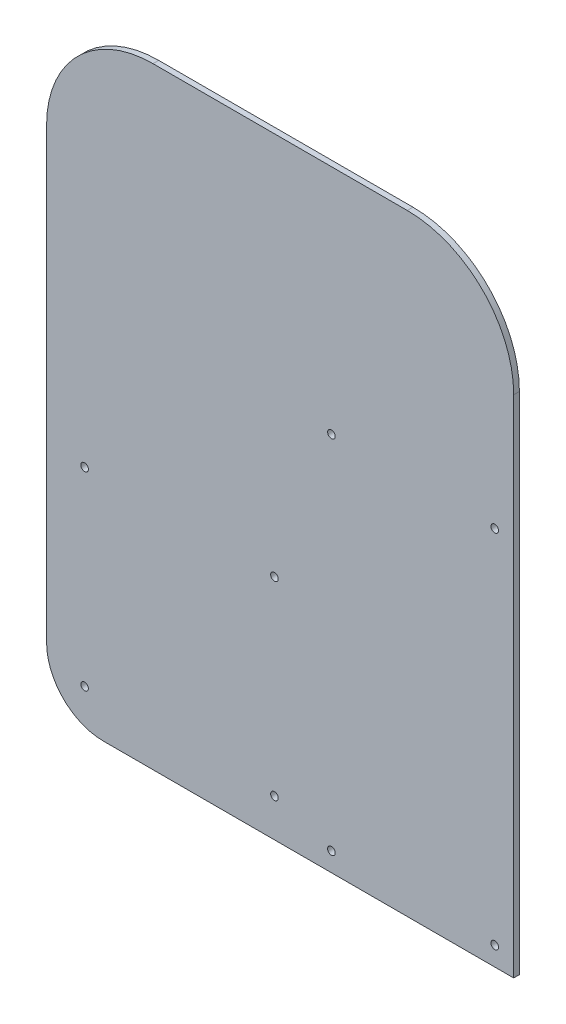
ISO-10303-21;
HEADER;
FILE_DESCRIPTION(('STEP AP214'),'2;1');
FILE_NAME('part.step','',(''),(''),'','','');
FILE_SCHEMA(('AUTOMOTIVE_DESIGN { 1 0 10303 214 1 1 1 1 }'));
ENDSEC;
DATA;
#1=APPLICATION_CONTEXT('core data for automotive mechanical design processes');
#2=APPLICATION_PROTOCOL_DEFINITION('international standard','automotive_design',2000,#1);
#3=PRODUCT_CONTEXT('',#1,'mechanical');
#4=PRODUCT('Part','Part','',(#3));
#5=PRODUCT_RELATED_PRODUCT_CATEGORY('part','',(#4));
#6=PRODUCT_DEFINITION_FORMATION('','',#4);
#7=PRODUCT_DEFINITION_CONTEXT('part definition',#1,'design');
#8=PRODUCT_DEFINITION('design','',#6,#7);
#9=PRODUCT_DEFINITION_SHAPE('','',#8);
#10=(LENGTH_UNIT() NAMED_UNIT(*) SI_UNIT(.MILLI.,.METRE.));
#11=(NAMED_UNIT(*) PLANE_ANGLE_UNIT() SI_UNIT($,.RADIAN.));
#12=(NAMED_UNIT(*) SI_UNIT($,.STERADIAN.) SOLID_ANGLE_UNIT());
#13=UNCERTAINTY_MEASURE_WITH_UNIT(LENGTH_MEASURE(1.E-05),#10,'distance_accuracy_value','');
#14=(GEOMETRIC_REPRESENTATION_CONTEXT(3) GLOBAL_UNCERTAINTY_ASSIGNED_CONTEXT((#13)) GLOBAL_UNIT_ASSIGNED_CONTEXT((#10,
#11,#12)) REPRESENTATION_CONTEXT('',''));
#15=CARTESIAN_POINT('',(0.,0.,0.));
#16=DIRECTION('',(0.,0.,1.));
#17=DIRECTION('',(1.,0.,0.));
#18=AXIS2_PLACEMENT_3D('',#15,#16,#17);
#19=CARTESIAN_POINT('',(30.,0.,3.));
#20=DIRECTION('',(0.,0.,1.));
#21=DIRECTION('',(1.,0.,0.));
#22=AXIS2_PLACEMENT_3D('',#19,#20,#21);
#23=PLANE('',#22);
#24=CARTESIAN_POINT('',(236.,-20.,3.));
#25=DIRECTION('',(0.,0.,1.));
#26=DIRECTION('',(1.,0.,0.));
#27=AXIS2_PLACEMENT_3D('',#24,#25,#26);
#28=CIRCLE('',#27,2.);
#29=CARTESIAN_POINT('',(238.,-20.,3.));
#30=VERTEX_POINT('',#29);
#31=EDGE_CURVE('E238',#30,#30,#28,.T.);
#32=ORIENTED_EDGE('',*,*,#31,.F.);
#33=EDGE_LOOP('',(#32));
#34=FACE_BOUND('',#33,.T.);
#35=CARTESIAN_POINT('',(150.,170.,3.));
#36=DIRECTION('',(0.,0.,1.));
#37=DIRECTION('',(1.,0.,0.));
#38=AXIS2_PLACEMENT_3D('',#35,#36,#37);
#39=CIRCLE('',#38,2.);
#40=CARTESIAN_POINT('',(152.,170.,3.));
#41=VERTEX_POINT('',#40);
#42=EDGE_CURVE('E222',#41,#41,#39,.T.);
#43=ORIENTED_EDGE('',*,*,#42,.F.);
#44=EDGE_LOOP('',(#43));
#45=FACE_BOUND('',#44,.T.);
#46=CARTESIAN_POINT('',(120.,90.,3.));
#47=DIRECTION('',(0.,0.,1.));
#48=DIRECTION('',(1.,0.,0.));
#49=AXIS2_PLACEMENT_3D('',#46,#47,#48);
#50=CIRCLE('',#49,2.);
#51=CARTESIAN_POINT('',(122.,90.,3.));
#52=VERTEX_POINT('',#51);
#53=EDGE_CURVE('E206',#52,#52,#50,.T.);
#54=ORIENTED_EDGE('',*,*,#53,.F.);
#55=EDGE_LOOP('',(#54));
#56=FACE_BOUND('',#55,.T.);
#57=CARTESIAN_POINT('',(20.,-9.99999999999999,3.));
#58=DIRECTION('',(0.,0.,1.));
#59=DIRECTION('',(1.,0.,0.));
#60=AXIS2_PLACEMENT_3D('',#57,#58,#59);
#61=CIRCLE('',#60,2.);
#62=CARTESIAN_POINT('',(22.,-9.99999999999999,3.));
#63=VERTEX_POINT('',#62);
#64=EDGE_CURVE('E145',#63,#63,#61,.T.);
#65=ORIENTED_EDGE('',*,*,#64,.F.);
#66=EDGE_LOOP('',(#65));
#67=FACE_BOUND('',#66,.T.);
#68=CARTESIAN_POINT('',(30.,0.,3.));
#69=DIRECTION('',(0.,0.,1.));
#70=DIRECTION('',(1.,0.,0.));
#71=AXIS2_PLACEMENT_3D('',#68,#69,#70);
#72=CIRCLE('',#71,30.);
#73=CARTESIAN_POINT('',(0.,0.,3.));
#74=VERTEX_POINT('',#73);
#75=CARTESIAN_POINT('',(30.,-30.,3.));
#76=VERTEX_POINT('',#75);
#77=EDGE_CURVE('E162',#74,#76,#72,.T.);
#78=ORIENTED_EDGE('',*,*,#77,.T.);
#79=DIRECTION('',(1.,0.,0.));
#80=VECTOR('',#79,1.);
#81=CARTESIAN_POINT('',(30.,-30.,3.));
#82=LINE('',#81,#80);
#83=CARTESIAN_POINT('',(246.,-30.,3.));
#84=VERTEX_POINT('',#83);
#85=EDGE_CURVE('E99',#76,#84,#82,.T.);
#86=ORIENTED_EDGE('',*,*,#85,.T.);
#87=DIRECTION('',(0.,1.,0.));
#88=VECTOR('',#87,1.);
#89=CARTESIAN_POINT('',(246.,180.,3.));
#90=LINE('',#89,#88);
#91=CARTESIAN_POINT('',(246.,235.988905846354,3.));
#92=VERTEX_POINT('',#91);
#93=EDGE_CURVE('E178',#84,#92,#90,.T.);
#94=ORIENTED_EDGE('',*,*,#93,.T.);
#95=CARTESIAN_POINT('',(189.951998033855,235.988905846354,3.));
#96=DIRECTION('',(0.,0.,1.));
#97=DIRECTION('',(1.,0.,0.));
#98=AXIS2_PLACEMENT_3D('',#95,#96,#97);
#99=CIRCLE('',#98,56.0480019661446);
#100=CARTESIAN_POINT('',(189.951998033855,292.036907812499,3.));
#101=VERTEX_POINT('',#100);
#102=EDGE_CURVE('E116',#92,#101,#99,.T.);
#103=ORIENTED_EDGE('',*,*,#102,.T.);
#104=DIRECTION('',(-1.,0.,0.));
#105=VECTOR('',#104,1.);
#106=CARTESIAN_POINT('',(56.0480019661446,292.036907812499,3.));
#107=LINE('',#106,#105);
#108=CARTESIAN_POINT('',(56.0480019661446,292.036907812499,3.));
#109=VERTEX_POINT('',#108);
#110=EDGE_CURVE('E109',#101,#109,#107,.T.);
#111=ORIENTED_EDGE('',*,*,#110,.T.);
#112=CARTESIAN_POINT('',(56.0480019661446,235.988905846354,3.));
#113=DIRECTION('',(0.,0.,1.));
#114=DIRECTION('',(-1.,0.,0.));
#115=AXIS2_PLACEMENT_3D('',#112,#113,#114);
#116=CIRCLE('',#115,56.0480019661446);
#117=CARTESIAN_POINT('',(0.,235.988905846354,3.));
#118=VERTEX_POINT('',#117);
#119=EDGE_CURVE('E113',#109,#118,#116,.T.);
#120=ORIENTED_EDGE('',*,*,#119,.T.);
#121=DIRECTION('',(0.,-1.,0.));
#122=VECTOR('',#121,1.);
#123=CARTESIAN_POINT('',(0.,80.,3.));
#124=LINE('',#123,#122);
#125=EDGE_CURVE('E61',#118,#74,#124,.T.);
#126=ORIENTED_EDGE('',*,*,#125,.T.);
#127=EDGE_LOOP('',(#78,#86,#94,#103,#111,#120,#126));
#128=FACE_BOUND('',#127,.T.);
#129=CARTESIAN_POINT('',(120.,-9.99999999999999,3.));
#130=DIRECTION('',(0.,0.,1.));
#131=DIRECTION('',(-1.,0.,0.));
#132=AXIS2_PLACEMENT_3D('',#129,#130,#131);
#133=CIRCLE('',#132,2.);
#134=CARTESIAN_POINT('',(118.,-9.99999999999999,3.));
#135=VERTEX_POINT('',#134);
#136=EDGE_CURVE('E198',#135,#135,#133,.T.);
#137=ORIENTED_EDGE('',*,*,#136,.F.);
#138=EDGE_LOOP('',(#137));
#139=FACE_BOUND('',#138,.T.);
#140=CARTESIAN_POINT('',(20.,90.,3.));
#141=DIRECTION('',(0.,0.,1.));
#142=DIRECTION('',(-1.,0.,0.));
#143=AXIS2_PLACEMENT_3D('',#140,#141,#142);
#144=CIRCLE('',#143,2.);
#145=CARTESIAN_POINT('',(18.,90.,3.));
#146=VERTEX_POINT('',#145);
#147=EDGE_CURVE('E214',#146,#146,#144,.T.);
#148=ORIENTED_EDGE('',*,*,#147,.F.);
#149=EDGE_LOOP('',(#148));
#150=FACE_BOUND('',#149,.T.);
#151=CARTESIAN_POINT('',(236.,170.,3.));
#152=DIRECTION('',(0.,0.,1.));
#153=DIRECTION('',(-1.,0.,0.));
#154=AXIS2_PLACEMENT_3D('',#151,#152,#153);
#155=CIRCLE('',#154,2.);
#156=CARTESIAN_POINT('',(234.,170.,3.));
#157=VERTEX_POINT('',#156);
#158=EDGE_CURVE('E230',#157,#157,#155,.T.);
#159=ORIENTED_EDGE('',*,*,#158,.F.);
#160=EDGE_LOOP('',(#159));
#161=FACE_BOUND('',#160,.T.);
#162=CARTESIAN_POINT('',(150.,-20.,3.));
#163=DIRECTION('',(0.,0.,1.));
#164=DIRECTION('',(-1.,0.,0.));
#165=AXIS2_PLACEMENT_3D('',#162,#163,#164);
#166=CIRCLE('',#165,2.);
#167=CARTESIAN_POINT('',(148.,-20.,3.));
#168=VERTEX_POINT('',#167);
#169=EDGE_CURVE('E246',#168,#168,#166,.T.);
#170=ORIENTED_EDGE('',*,*,#169,.F.);
#171=EDGE_LOOP('',(#170));
#172=FACE_BOUND('',#171,.T.);
#173=ADVANCED_FACE('F43',(#34,#45,#56,#67,#128,#139,#150,#161,#172),#23,.T.);
#174=CARTESIAN_POINT('',(30.,0.,0.));
#175=DIRECTION('',(0.,0.,1.));
#176=DIRECTION('',(1.,0.,0.));
#177=AXIS2_PLACEMENT_3D('',#174,#175,#176);
#178=PLANE('',#177);
#179=CARTESIAN_POINT('',(30.,0.,0.));
#180=DIRECTION('',(0.,0.,1.));
#181=DIRECTION('',(1.,0.,0.));
#182=AXIS2_PLACEMENT_3D('',#179,#180,#181);
#183=CIRCLE('',#182,30.);
#184=CARTESIAN_POINT('',(0.,0.,0.));
#185=VERTEX_POINT('',#184);
#186=CARTESIAN_POINT('',(30.,-30.,0.));
#187=VERTEX_POINT('',#186);
#188=EDGE_CURVE('E140',#185,#187,#183,.T.);
#189=ORIENTED_EDGE('',*,*,#188,.F.);
#190=DIRECTION('',(0.,-1.,0.));
#191=VECTOR('',#190,1.);
#192=CARTESIAN_POINT('',(0.,0.,0.));
#193=LINE('',#192,#191);
#194=CARTESIAN_POINT('',(0.,235.988905846354,0.));
#195=VERTEX_POINT('',#194);
#196=EDGE_CURVE('E87',#195,#185,#193,.T.);
#197=ORIENTED_EDGE('',*,*,#196,.F.);
#198=CARTESIAN_POINT('',(56.0480019661446,235.988905846354,0.));
#199=DIRECTION('',(0.,0.,1.));
#200=DIRECTION('',(-1.,0.,0.));
#201=AXIS2_PLACEMENT_3D('',#198,#199,#200);
#202=CIRCLE('',#201,56.0480019661446);
#203=CARTESIAN_POINT('',(56.0480019661446,292.036907812499,0.));
#204=VERTEX_POINT('',#203);
#205=EDGE_CURVE('E157',#204,#195,#202,.T.);
#206=ORIENTED_EDGE('',*,*,#205,.F.);
#207=DIRECTION('',(-1.,0.,0.));
#208=VECTOR('',#207,1.);
#209=CARTESIAN_POINT('',(56.0480019661446,292.036907812499,0.));
#210=LINE('',#209,#208);
#211=CARTESIAN_POINT('',(189.951998033855,292.036907812499,0.));
#212=VERTEX_POINT('',#211);
#213=EDGE_CURVE('E126',#212,#204,#210,.T.);
#214=ORIENTED_EDGE('',*,*,#213,.F.);
#215=CARTESIAN_POINT('',(189.951998033855,235.988905846354,0.));
#216=DIRECTION('',(0.,0.,1.));
#217=DIRECTION('',(1.,0.,0.));
#218=AXIS2_PLACEMENT_3D('',#215,#216,#217);
#219=CIRCLE('',#218,56.0480019661446);
#220=CARTESIAN_POINT('',(246.,235.988905846354,0.));
#221=VERTEX_POINT('',#220);
#222=EDGE_CURVE('E152',#221,#212,#219,.T.);
#223=ORIENTED_EDGE('',*,*,#222,.F.);
#224=DIRECTION('',(0.,1.,0.));
#225=VECTOR('',#224,1.);
#226=CARTESIAN_POINT('',(246.,180.,0.));
#227=LINE('',#226,#225);
#228=CARTESIAN_POINT('',(246.,-30.,0.));
#229=VERTEX_POINT('',#228);
#230=EDGE_CURVE('E149',#229,#221,#227,.T.);
#231=ORIENTED_EDGE('',*,*,#230,.F.);
#232=DIRECTION('',(1.,0.,0.));
#233=VECTOR('',#232,1.);
#234=CARTESIAN_POINT('',(246.,-30.,0.));
#235=LINE('',#234,#233);
#236=EDGE_CURVE('E144',#187,#229,#235,.T.);
#237=ORIENTED_EDGE('',*,*,#236,.F.);
#238=EDGE_LOOP('',(#189,#197,#206,#214,#223,#231,#237));
#239=FACE_BOUND('',#238,.T.);
#240=CARTESIAN_POINT('',(20.,-9.99999999999999,0.));
#241=DIRECTION('',(0.,0.,1.));
#242=DIRECTION('',(1.,0.,0.));
#243=AXIS2_PLACEMENT_3D('',#240,#241,#242);
#244=CIRCLE('',#243,2.);
#245=CARTESIAN_POINT('',(22.,-9.99999999999999,0.));
#246=VERTEX_POINT('',#245);
#247=EDGE_CURVE('E194',#246,#246,#244,.T.);
#248=ORIENTED_EDGE('',*,*,#247,.T.);
#249=EDGE_LOOP('',(#248));
#250=FACE_BOUND('',#249,.T.);
#251=CARTESIAN_POINT('',(120.,-9.99999999999999,0.));
#252=DIRECTION('',(0.,0.,1.));
#253=DIRECTION('',(-1.,0.,0.));
#254=AXIS2_PLACEMENT_3D('',#251,#252,#253);
#255=CIRCLE('',#254,2.);
#256=CARTESIAN_POINT('',(118.,-9.99999999999999,0.));
#257=VERTEX_POINT('',#256);
#258=EDGE_CURVE('E202',#257,#257,#255,.T.);
#259=ORIENTED_EDGE('',*,*,#258,.T.);
#260=EDGE_LOOP('',(#259));
#261=FACE_BOUND('',#260,.T.);
#262=CARTESIAN_POINT('',(120.,90.,0.));
#263=DIRECTION('',(0.,0.,1.));
#264=DIRECTION('',(1.,0.,0.));
#265=AXIS2_PLACEMENT_3D('',#262,#263,#264);
#266=CIRCLE('',#265,2.);
#267=CARTESIAN_POINT('',(122.,90.,0.));
#268=VERTEX_POINT('',#267);
#269=EDGE_CURVE('E210',#268,#268,#266,.T.);
#270=ORIENTED_EDGE('',*,*,#269,.T.);
#271=EDGE_LOOP('',(#270));
#272=FACE_BOUND('',#271,.T.);
#273=CARTESIAN_POINT('',(20.,90.,0.));
#274=DIRECTION('',(0.,0.,1.));
#275=DIRECTION('',(-1.,0.,0.));
#276=AXIS2_PLACEMENT_3D('',#273,#274,#275);
#277=CIRCLE('',#276,2.);
#278=CARTESIAN_POINT('',(18.,90.,0.));
#279=VERTEX_POINT('',#278);
#280=EDGE_CURVE('E218',#279,#279,#277,.T.);
#281=ORIENTED_EDGE('',*,*,#280,.T.);
#282=EDGE_LOOP('',(#281));
#283=FACE_BOUND('',#282,.T.);
#284=CARTESIAN_POINT('',(150.,170.,0.));
#285=DIRECTION('',(0.,0.,1.));
#286=DIRECTION('',(1.,0.,0.));
#287=AXIS2_PLACEMENT_3D('',#284,#285,#286);
#288=CIRCLE('',#287,2.);
#289=CARTESIAN_POINT('',(152.,170.,0.));
#290=VERTEX_POINT('',#289);
#291=EDGE_CURVE('E226',#290,#290,#288,.T.);
#292=ORIENTED_EDGE('',*,*,#291,.T.);
#293=EDGE_LOOP('',(#292));
#294=FACE_BOUND('',#293,.T.);
#295=CARTESIAN_POINT('',(236.,170.,0.));
#296=DIRECTION('',(0.,0.,1.));
#297=DIRECTION('',(-1.,0.,0.));
#298=AXIS2_PLACEMENT_3D('',#295,#296,#297);
#299=CIRCLE('',#298,2.);
#300=CARTESIAN_POINT('',(234.,170.,0.));
#301=VERTEX_POINT('',#300);
#302=EDGE_CURVE('E234',#301,#301,#299,.T.);
#303=ORIENTED_EDGE('',*,*,#302,.T.);
#304=EDGE_LOOP('',(#303));
#305=FACE_BOUND('',#304,.T.);
#306=CARTESIAN_POINT('',(236.,-20.,0.));
#307=DIRECTION('',(0.,0.,1.));
#308=DIRECTION('',(1.,0.,0.));
#309=AXIS2_PLACEMENT_3D('',#306,#307,#308);
#310=CIRCLE('',#309,2.);
#311=CARTESIAN_POINT('',(238.,-20.,0.));
#312=VERTEX_POINT('',#311);
#313=EDGE_CURVE('E242',#312,#312,#310,.T.);
#314=ORIENTED_EDGE('',*,*,#313,.T.);
#315=EDGE_LOOP('',(#314));
#316=FACE_BOUND('',#315,.T.);
#317=CARTESIAN_POINT('',(150.,-20.,0.));
#318=DIRECTION('',(0.,0.,1.));
#319=DIRECTION('',(-1.,0.,0.));
#320=AXIS2_PLACEMENT_3D('',#317,#318,#319);
#321=CIRCLE('',#320,2.);
#322=CARTESIAN_POINT('',(148.,-20.,0.));
#323=VERTEX_POINT('',#322);
#324=EDGE_CURVE('E250',#323,#323,#321,.T.);
#325=ORIENTED_EDGE('',*,*,#324,.T.);
#326=EDGE_LOOP('',(#325));
#327=FACE_BOUND('',#326,.T.);
#328=ADVANCED_FACE('F181',(#239,#250,#261,#272,#283,#294,#305,#316,#327),#178,.F.);
#329=CARTESIAN_POINT('',(30.,0.,3.));
#330=DIRECTION('',(0.,0.,-1.));
#331=DIRECTION('',(-1.,0.,0.));
#332=AXIS2_PLACEMENT_3D('',#329,#330,#331);
#333=CYLINDRICAL_SURFACE('',#332,30.);
#334=ORIENTED_EDGE('',*,*,#188,.T.);
#335=DIRECTION('',(0.,0.,-1.));
#336=VECTOR('',#335,1.);
#337=CARTESIAN_POINT('',(30.,-30.,3.));
#338=LINE('',#337,#336);
#339=EDGE_CURVE('E11',#76,#187,#338,.T.);
#340=ORIENTED_EDGE('',*,*,#339,.F.);
#341=ORIENTED_EDGE('',*,*,#77,.F.);
#342=DIRECTION('',(0.,0.,-1.));
#343=VECTOR('',#342,1.);
#344=CARTESIAN_POINT('',(0.,0.,3.));
#345=LINE('',#344,#343);
#346=EDGE_CURVE('E136',#74,#185,#345,.T.);
#347=ORIENTED_EDGE('',*,*,#346,.T.);
#348=EDGE_LOOP('',(#334,#340,#341,#347));
#349=FACE_BOUND('',#348,.T.);
#350=ADVANCED_FACE('F45',(#349),#333,.T.);
#351=CARTESIAN_POINT('',(246.,-30.,3.));
#352=DIRECTION('',(0.,1.,0.));
#353=DIRECTION('',(-1.,0.,0.));
#354=AXIS2_PLACEMENT_3D('',#351,#352,#353);
#355=PLANE('',#354);
#356=ORIENTED_EDGE('',*,*,#236,.T.);
#357=DIRECTION('',(0.,0.,-1.));
#358=VECTOR('',#357,1.);
#359=CARTESIAN_POINT('',(246.,-30.,3.));
#360=LINE('',#359,#358);
#361=EDGE_CURVE('E53',#84,#229,#360,.T.);
#362=ORIENTED_EDGE('',*,*,#361,.F.);
#363=ORIENTED_EDGE('',*,*,#85,.F.);
#364=ORIENTED_EDGE('',*,*,#339,.T.);
#365=EDGE_LOOP('',(#356,#362,#363,#364));
#366=FACE_BOUND('',#365,.T.);
#367=ADVANCED_FACE('F179',(#366),#355,.F.);
#368=CARTESIAN_POINT('',(246.,180.,3.));
#369=DIRECTION('',(-1.,0.,0.));
#370=DIRECTION('',(0.,-1.,0.));
#371=AXIS2_PLACEMENT_3D('',#368,#369,#370);
#372=PLANE('',#371);
#373=ORIENTED_EDGE('',*,*,#230,.T.);
#374=DIRECTION('',(0.,0.,-1.));
#375=VECTOR('',#374,1.);
#376=CARTESIAN_POINT('',(246.,235.988905846354,3.));
#377=LINE('',#376,#375);
#378=EDGE_CURVE('E169',#92,#221,#377,.T.);
#379=ORIENTED_EDGE('',*,*,#378,.F.);
#380=ORIENTED_EDGE('',*,*,#93,.F.);
#381=ORIENTED_EDGE('',*,*,#361,.T.);
#382=EDGE_LOOP('',(#373,#379,#380,#381));
#383=FACE_BOUND('',#382,.T.);
#384=ADVANCED_FACE('F176',(#383),#372,.F.);
#385=CARTESIAN_POINT('',(189.951998033855,235.988905846354,3.));
#386=DIRECTION('',(0.,0.,-1.));
#387=DIRECTION('',(-1.,0.,0.));
#388=AXIS2_PLACEMENT_3D('',#385,#386,#387);
#389=CYLINDRICAL_SURFACE('',#388,56.0480019661446);
#390=ORIENTED_EDGE('',*,*,#222,.T.);
#391=DIRECTION('',(0.,0.,-1.));
#392=VECTOR('',#391,1.);
#393=CARTESIAN_POINT('',(189.951998033855,292.036907812499,3.));
#394=LINE('',#393,#392);
#395=EDGE_CURVE('E129',#101,#212,#394,.T.);
#396=ORIENTED_EDGE('',*,*,#395,.F.);
#397=ORIENTED_EDGE('',*,*,#102,.F.);
#398=ORIENTED_EDGE('',*,*,#378,.T.);
#399=EDGE_LOOP('',(#390,#396,#397,#398));
#400=FACE_BOUND('',#399,.T.);
#401=ADVANCED_FACE('F185',(#400),#389,.T.);
#402=CARTESIAN_POINT('',(56.0480019661446,292.036907812499,3.));
#403=DIRECTION('',(0.,-1.,0.));
#404=DIRECTION('',(1.,0.,0.));
#405=AXIS2_PLACEMENT_3D('',#402,#403,#404);
#406=PLANE('',#405);
#407=ORIENTED_EDGE('',*,*,#213,.T.);
#408=DIRECTION('',(0.,0.,-1.));
#409=VECTOR('',#408,1.);
#410=CARTESIAN_POINT('',(56.0480019661446,292.036907812499,3.));
#411=LINE('',#410,#409);
#412=EDGE_CURVE('E123',#109,#204,#411,.T.);
#413=ORIENTED_EDGE('',*,*,#412,.F.);
#414=ORIENTED_EDGE('',*,*,#110,.F.);
#415=ORIENTED_EDGE('',*,*,#395,.T.);
#416=EDGE_LOOP('',(#407,#413,#414,#415));
#417=FACE_BOUND('',#416,.T.);
#418=ADVANCED_FACE('F124',(#417),#406,.F.);
#419=CARTESIAN_POINT('',(56.0480019661446,235.988905846354,3.));
#420=DIRECTION('',(0.,0.,-1.));
#421=DIRECTION('',(-1.,0.,0.));
#422=AXIS2_PLACEMENT_3D('',#419,#420,#421);
#423=CYLINDRICAL_SURFACE('',#422,56.0480019661446);
#424=ORIENTED_EDGE('',*,*,#205,.T.);
#425=DIRECTION('',(0.,0.,-1.));
#426=VECTOR('',#425,1.);
#427=CARTESIAN_POINT('',(0.,235.988905846354,3.));
#428=LINE('',#427,#426);
#429=EDGE_CURVE('E130',#118,#195,#428,.T.);
#430=ORIENTED_EDGE('',*,*,#429,.F.);
#431=ORIENTED_EDGE('',*,*,#119,.F.);
#432=ORIENTED_EDGE('',*,*,#412,.T.);
#433=EDGE_LOOP('',(#424,#430,#431,#432));
#434=FACE_BOUND('',#433,.T.);
#435=ADVANCED_FACE('F132',(#434),#423,.T.);
#436=CARTESIAN_POINT('',(0.,0.,3.));
#437=DIRECTION('',(1.,0.,0.));
#438=DIRECTION('',(0.,0.,-1.));
#439=AXIS2_PLACEMENT_3D('',#436,#437,#438);
#440=PLANE('',#439);
#441=ORIENTED_EDGE('',*,*,#196,.T.);
#442=ORIENTED_EDGE('',*,*,#346,.F.);
#443=ORIENTED_EDGE('',*,*,#125,.F.);
#444=ORIENTED_EDGE('',*,*,#429,.T.);
#445=EDGE_LOOP('',(#441,#442,#443,#444));
#446=FACE_BOUND('',#445,.T.);
#447=ADVANCED_FACE('F274',(#446),#440,.F.);
#448=CARTESIAN_POINT('',(20.,-9.99999999999999,3.));
#449=DIRECTION('',(0.,0.,-1.));
#450=DIRECTION('',(-1.,0.,0.));
#451=AXIS2_PLACEMENT_3D('',#448,#449,#450);
#452=CYLINDRICAL_SURFACE('',#451,2.);
#453=ORIENTED_EDGE('',*,*,#64,.T.);
#454=EDGE_LOOP('',(#453));
#455=FACE_BOUND('',#454,.T.);
#456=ORIENTED_EDGE('',*,*,#247,.F.);
#457=EDGE_LOOP('',(#456));
#458=FACE_BOUND('',#457,.T.);
#459=ADVANCED_FACE('F271',(#455,#458),#452,.F.);
#460=CARTESIAN_POINT('',(120.,-9.99999999999999,3.));
#461=DIRECTION('',(0.,0.,-1.));
#462=DIRECTION('',(-1.,0.,0.));
#463=AXIS2_PLACEMENT_3D('',#460,#461,#462);
#464=CYLINDRICAL_SURFACE('',#463,2.);
#465=ORIENTED_EDGE('',*,*,#136,.T.);
#466=EDGE_LOOP('',(#465));
#467=FACE_BOUND('',#466,.T.);
#468=ORIENTED_EDGE('',*,*,#258,.F.);
#469=EDGE_LOOP('',(#468));
#470=FACE_BOUND('',#469,.T.);
#471=ADVANCED_FACE('F354',(#467,#470),#464,.F.);
#472=CARTESIAN_POINT('',(120.,90.,3.));
#473=DIRECTION('',(0.,0.,-1.));
#474=DIRECTION('',(-1.,0.,0.));
#475=AXIS2_PLACEMENT_3D('',#472,#473,#474);
#476=CYLINDRICAL_SURFACE('',#475,2.);
#477=ORIENTED_EDGE('',*,*,#53,.T.);
#478=EDGE_LOOP('',(#477));
#479=FACE_BOUND('',#478,.T.);
#480=ORIENTED_EDGE('',*,*,#269,.F.);
#481=EDGE_LOOP('',(#480));
#482=FACE_BOUND('',#481,.T.);
#483=ADVANCED_FACE('F363',(#479,#482),#476,.F.);
#484=CARTESIAN_POINT('',(20.,90.,3.));
#485=DIRECTION('',(0.,0.,-1.));
#486=DIRECTION('',(-1.,0.,0.));
#487=AXIS2_PLACEMENT_3D('',#484,#485,#486);
#488=CYLINDRICAL_SURFACE('',#487,2.);
#489=ORIENTED_EDGE('',*,*,#147,.T.);
#490=EDGE_LOOP('',(#489));
#491=FACE_BOUND('',#490,.T.);
#492=ORIENTED_EDGE('',*,*,#280,.F.);
#493=EDGE_LOOP('',(#492));
#494=FACE_BOUND('',#493,.T.);
#495=ADVANCED_FACE('F372',(#491,#494),#488,.F.);
#496=CARTESIAN_POINT('',(150.,170.,3.));
#497=DIRECTION('',(0.,0.,-1.));
#498=DIRECTION('',(-1.,0.,0.));
#499=AXIS2_PLACEMENT_3D('',#496,#497,#498);
#500=CYLINDRICAL_SURFACE('',#499,2.);
#501=ORIENTED_EDGE('',*,*,#42,.T.);
#502=EDGE_LOOP('',(#501));
#503=FACE_BOUND('',#502,.T.);
#504=ORIENTED_EDGE('',*,*,#291,.F.);
#505=EDGE_LOOP('',(#504));
#506=FACE_BOUND('',#505,.T.);
#507=ADVANCED_FACE('F382',(#503,#506),#500,.F.);
#508=CARTESIAN_POINT('',(236.,170.,3.));
#509=DIRECTION('',(0.,0.,-1.));
#510=DIRECTION('',(-1.,0.,0.));
#511=AXIS2_PLACEMENT_3D('',#508,#509,#510);
#512=CYLINDRICAL_SURFACE('',#511,2.);
#513=ORIENTED_EDGE('',*,*,#158,.T.);
#514=EDGE_LOOP('',(#513));
#515=FACE_BOUND('',#514,.T.);
#516=ORIENTED_EDGE('',*,*,#302,.F.);
#517=EDGE_LOOP('',(#516));
#518=FACE_BOUND('',#517,.T.);
#519=ADVANCED_FACE('F392',(#515,#518),#512,.F.);
#520=CARTESIAN_POINT('',(236.,-20.,3.));
#521=DIRECTION('',(0.,0.,-1.));
#522=DIRECTION('',(-1.,0.,0.));
#523=AXIS2_PLACEMENT_3D('',#520,#521,#522);
#524=CYLINDRICAL_SURFACE('',#523,2.);
#525=ORIENTED_EDGE('',*,*,#31,.T.);
#526=EDGE_LOOP('',(#525));
#527=FACE_BOUND('',#526,.T.);
#528=ORIENTED_EDGE('',*,*,#313,.F.);
#529=EDGE_LOOP('',(#528));
#530=FACE_BOUND('',#529,.T.);
#531=ADVANCED_FACE('F402',(#527,#530),#524,.F.);
#532=CARTESIAN_POINT('',(150.,-20.,3.));
#533=DIRECTION('',(0.,0.,-1.));
#534=DIRECTION('',(-1.,0.,0.));
#535=AXIS2_PLACEMENT_3D('',#532,#533,#534);
#536=CYLINDRICAL_SURFACE('',#535,2.);
#537=ORIENTED_EDGE('',*,*,#169,.T.);
#538=EDGE_LOOP('',(#537));
#539=FACE_BOUND('',#538,.T.);
#540=ORIENTED_EDGE('',*,*,#324,.F.);
#541=EDGE_LOOP('',(#540));
#542=FACE_BOUND('',#541,.T.);
#543=ADVANCED_FACE('F258',(#539,#542),#536,.F.);
#544=CLOSED_SHELL('',(#173,#328,#350,#367,#384,#401,#418,#435,#447,#459,#471,#483,#495,#507,
#519,#531,#543));
#545=MANIFOLD_SOLID_BREP('B2',#544);
#546=ADVANCED_BREP_SHAPE_REPRESENTATION('',(#18,#545),#14);
#547=SHAPE_DEFINITION_REPRESENTATION(#9,#546);
ENDSEC;
END-ISO-10303-21;
